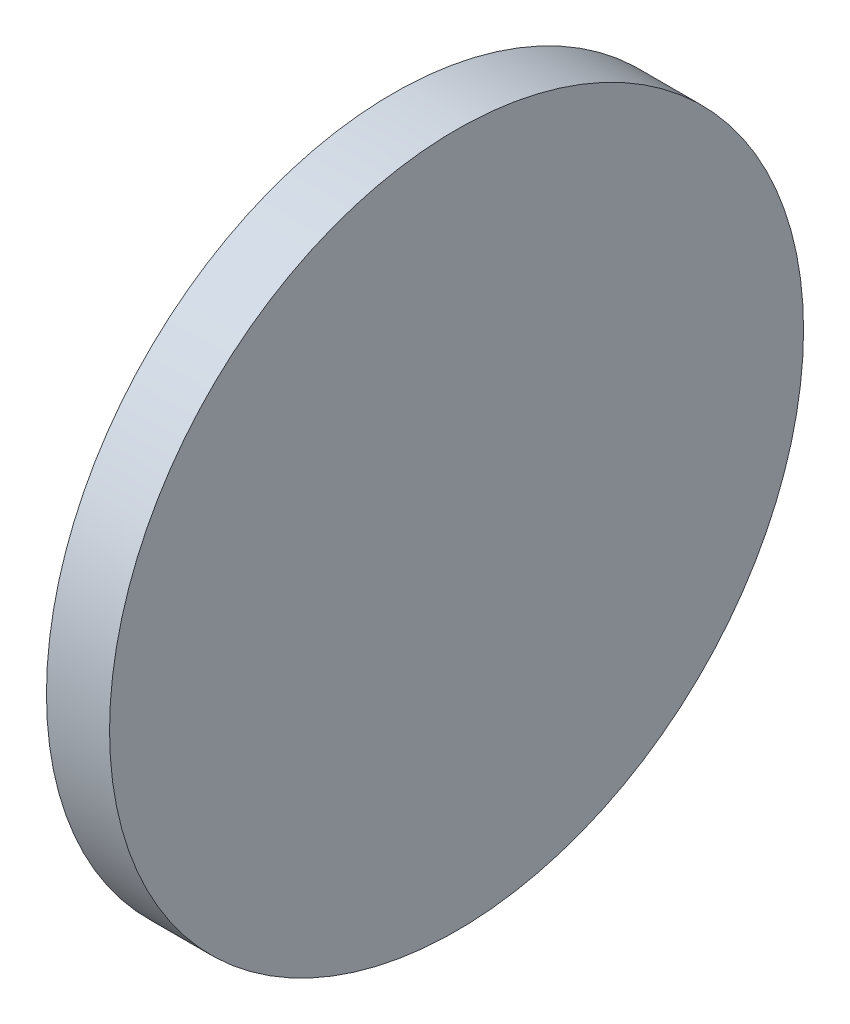
ISO-10303-21;
HEADER;
FILE_DESCRIPTION(('STEP AP214'),'2;1');
FILE_NAME('part.step','',(''),(''),'','','');
FILE_SCHEMA(('AUTOMOTIVE_DESIGN { 1 0 10303 214 1 1 1 1 }'));
ENDSEC;
DATA;
#1=APPLICATION_CONTEXT('core data for automotive mechanical design processes');
#2=APPLICATION_PROTOCOL_DEFINITION('international standard','automotive_design',2000,#1);
#3=PRODUCT_CONTEXT('',#1,'mechanical');
#4=PRODUCT('Part','Part','',(#3));
#5=PRODUCT_RELATED_PRODUCT_CATEGORY('part','',(#4));
#6=PRODUCT_DEFINITION_FORMATION('','',#4);
#7=PRODUCT_DEFINITION_CONTEXT('part definition',#1,'design');
#8=PRODUCT_DEFINITION('design','',#6,#7);
#9=PRODUCT_DEFINITION_SHAPE('','',#8);
#10=(LENGTH_UNIT() NAMED_UNIT(*) SI_UNIT(.MILLI.,.METRE.));
#11=(NAMED_UNIT(*) PLANE_ANGLE_UNIT() SI_UNIT($,.RADIAN.));
#12=(NAMED_UNIT(*) SI_UNIT($,.STERADIAN.) SOLID_ANGLE_UNIT());
#13=UNCERTAINTY_MEASURE_WITH_UNIT(LENGTH_MEASURE(1.E-05),#10,'distance_accuracy_value','');
#14=(GEOMETRIC_REPRESENTATION_CONTEXT(3) GLOBAL_UNCERTAINTY_ASSIGNED_CONTEXT((#13)) GLOBAL_UNIT_ASSIGNED_CONTEXT((#10,
#11,#12)) REPRESENTATION_CONTEXT('',''));
#15=CARTESIAN_POINT('',(0.,0.,0.));
#16=DIRECTION('',(0.,0.,1.));
#17=DIRECTION('',(1.,0.,0.));
#18=AXIS2_PLACEMENT_3D('',#15,#16,#17);
#19=CARTESIAN_POINT('',(20.,0.,0.));
#20=DIRECTION('',(-1.,0.,0.));
#21=DIRECTION('',(0.,0.,1.));
#22=AXIS2_PLACEMENT_3D('',#19,#20,#21);
#23=CYLINDRICAL_SURFACE('',#22,110.);
#24=CARTESIAN_POINT('',(20.,0.,0.));
#25=DIRECTION('',(1.,0.,0.));
#26=DIRECTION('',(0.,0.,-1.));
#27=AXIS2_PLACEMENT_3D('',#24,#25,#26);
#28=CIRCLE('',#27,110.);
#29=CARTESIAN_POINT('',(20.,0.,-110.));
#30=VERTEX_POINT('',#29);
#31=EDGE_CURVE('E10',#30,#30,#28,.T.);
#32=ORIENTED_EDGE('',*,*,#31,.F.);
#33=EDGE_LOOP('',(#32));
#34=FACE_BOUND('',#33,.T.);
#35=CARTESIAN_POINT('',(0.,0.,0.));
#36=DIRECTION('',(1.,0.,0.));
#37=DIRECTION('',(0.,0.,-1.));
#38=AXIS2_PLACEMENT_3D('',#35,#36,#37);
#39=CIRCLE('',#38,110.);
#40=CARTESIAN_POINT('',(0.,0.,-110.));
#41=VERTEX_POINT('',#40);
#42=EDGE_CURVE('E40',#41,#41,#39,.T.);
#43=ORIENTED_EDGE('',*,*,#42,.T.);
#44=EDGE_LOOP('',(#43));
#45=FACE_BOUND('',#44,.T.);
#46=ADVANCED_FACE('F37',(#34,#45),#23,.T.);
#47=CARTESIAN_POINT('',(20.,0.,0.));
#48=DIRECTION('',(1.,0.,0.));
#49=DIRECTION('',(0.,0.,-1.));
#50=AXIS2_PLACEMENT_3D('',#47,#48,#49);
#51=PLANE('',#50);
#52=ORIENTED_EDGE('',*,*,#31,.T.);
#53=EDGE_LOOP('',(#52));
#54=FACE_BOUND('',#53,.T.);
#55=ADVANCED_FACE('F54',(#54),#51,.T.);
#56=CARTESIAN_POINT('',(0.,0.,0.));
#57=DIRECTION('',(1.,0.,0.));
#58=DIRECTION('',(0.,0.,-1.));
#59=AXIS2_PLACEMENT_3D('',#56,#57,#58);
#60=PLANE('',#59);
#61=ORIENTED_EDGE('',*,*,#42,.F.);
#62=EDGE_LOOP('',(#61));
#63=FACE_BOUND('',#62,.T.);
#64=ADVANCED_FACE('F52',(#63),#60,.F.);
#65=CLOSED_SHELL('',(#46,#55,#64));
#66=MANIFOLD_SOLID_BREP('B2',#65);
#67=ADVANCED_BREP_SHAPE_REPRESENTATION('',(#18,#66),#14);
#68=SHAPE_DEFINITION_REPRESENTATION(#9,#67);
ENDSEC;
END-ISO-10303-21;
